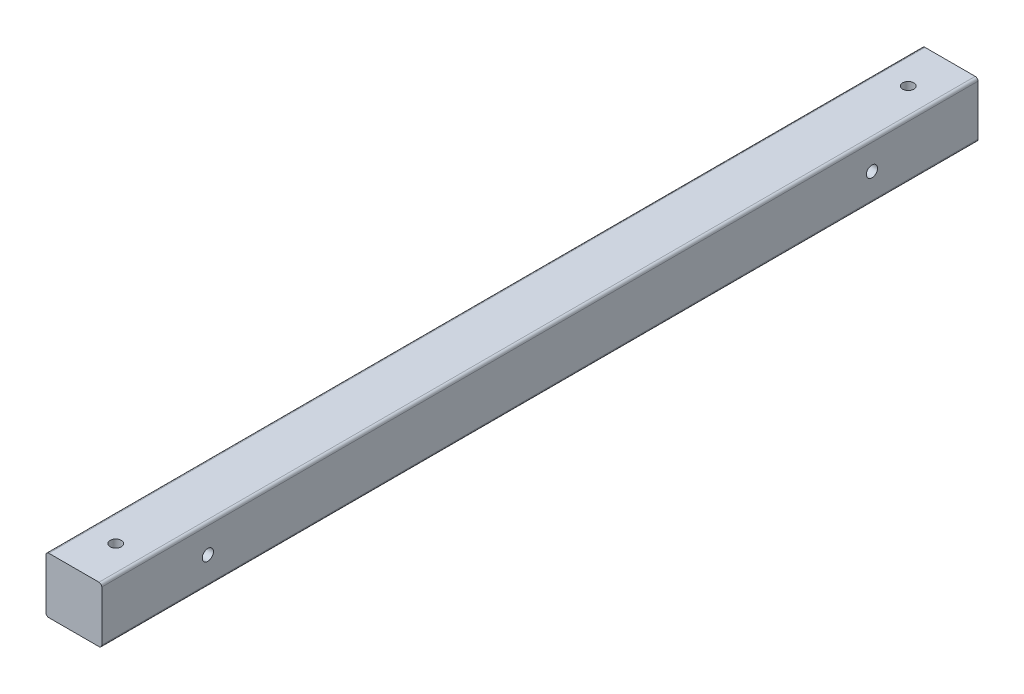
ISO-10303-21;
HEADER;
FILE_DESCRIPTION(('STEP AP214'),'2;1');
FILE_NAME('part.step','',(''),(''),'','','');
FILE_SCHEMA(('AUTOMOTIVE_DESIGN { 1 0 10303 214 1 1 1 1 }'));
ENDSEC;
DATA;
#1=APPLICATION_CONTEXT('core data for automotive mechanical design processes');
#2=APPLICATION_PROTOCOL_DEFINITION('international standard','automotive_design',2000,#1);
#3=PRODUCT_CONTEXT('',#1,'mechanical');
#4=PRODUCT('Part','Part','',(#3));
#5=PRODUCT_RELATED_PRODUCT_CATEGORY('part','',(#4));
#6=PRODUCT_DEFINITION_FORMATION('','',#4);
#7=PRODUCT_DEFINITION_CONTEXT('part definition',#1,'design');
#8=PRODUCT_DEFINITION('design','',#6,#7);
#9=PRODUCT_DEFINITION_SHAPE('','',#8);
#10=(LENGTH_UNIT() NAMED_UNIT(*) SI_UNIT(.MILLI.,.METRE.));
#11=(NAMED_UNIT(*) PLANE_ANGLE_UNIT() SI_UNIT($,.RADIAN.));
#12=(NAMED_UNIT(*) SI_UNIT($,.STERADIAN.) SOLID_ANGLE_UNIT());
#13=UNCERTAINTY_MEASURE_WITH_UNIT(LENGTH_MEASURE(1.E-05),#10,'distance_accuracy_value','');
#14=(GEOMETRIC_REPRESENTATION_CONTEXT(3) GLOBAL_UNCERTAINTY_ASSIGNED_CONTEXT((#13)) GLOBAL_UNIT_ASSIGNED_CONTEXT((#10,
#11,#12)) REPRESENTATION_CONTEXT('',''));
#15=CARTESIAN_POINT('',(0.,0.,0.));
#16=DIRECTION('',(0.,0.,1.));
#17=DIRECTION('',(1.,0.,0.));
#18=AXIS2_PLACEMENT_3D('',#15,#16,#17);
#19=CARTESIAN_POINT('',(0.,0.,314.));
#20=DIRECTION('',(1.,0.,0.));
#21=DIRECTION('',(0.,0.,-1.));
#22=AXIS2_PLACEMENT_3D('',#19,#20,#21);
#23=PLANE('',#22);
#24=CARTESIAN_POINT('',(0.,10.,38.));
#25=DIRECTION('',(-1.,0.,0.));
#26=DIRECTION('',(0.,0.,1.));
#27=AXIS2_PLACEMENT_3D('',#24,#25,#26);
#28=CIRCLE('',#27,2.);
#29=CARTESIAN_POINT('',(0.,10.,40.));
#30=VERTEX_POINT('',#29);
#31=EDGE_CURVE('E263',#30,#30,#28,.T.);
#32=ORIENTED_EDGE('',*,*,#31,.F.);
#33=EDGE_LOOP('',(#32));
#34=FACE_BOUND('',#33,.T.);
#35=CARTESIAN_POINT('',(0.,10.,276.));
#36=DIRECTION('',(-1.,0.,0.));
#37=DIRECTION('',(0.,0.,1.));
#38=AXIS2_PLACEMENT_3D('',#35,#36,#37);
#39=CIRCLE('',#38,2.);
#40=CARTESIAN_POINT('',(0.,10.,278.));
#41=VERTEX_POINT('',#40);
#42=EDGE_CURVE('E264',#41,#41,#39,.T.);
#43=ORIENTED_EDGE('',*,*,#42,.F.);
#44=EDGE_LOOP('',(#43));
#45=FACE_BOUND('',#44,.T.);
#46=DIRECTION('',(0.,-1.,0.));
#47=VECTOR('',#46,1.);
#48=CARTESIAN_POINT('',(0.,0.,0.));
#49=LINE('',#48,#47);
#50=CARTESIAN_POINT('',(0.,19.,0.));
#51=VERTEX_POINT('',#50);
#52=CARTESIAN_POINT('',(0.,1.,0.));
#53=VERTEX_POINT('',#52);
#54=EDGE_CURVE('E134',#51,#53,#49,.T.);
#55=ORIENTED_EDGE('',*,*,#54,.T.);
#56=DIRECTION('',(0.,0.,-1.));
#57=VECTOR('',#56,1.);
#58=CARTESIAN_POINT('',(0.,1.,314.));
#59=LINE('',#58,#57);
#60=CARTESIAN_POINT('',(0.,1.,314.));
#61=VERTEX_POINT('',#60);
#62=EDGE_CURVE('E109',#53,#61,#59,.F.);
#63=ORIENTED_EDGE('',*,*,#62,.T.);
#64=DIRECTION('',(0.,-1.,0.));
#65=VECTOR('',#64,1.);
#66=CARTESIAN_POINT('',(0.,0.,314.));
#67=LINE('',#66,#65);
#68=CARTESIAN_POINT('',(0.,19.,314.));
#69=VERTEX_POINT('',#68);
#70=EDGE_CURVE('E147',#69,#61,#67,.T.);
#71=ORIENTED_EDGE('',*,*,#70,.F.);
#72=DIRECTION('',(0.,0.,-1.));
#73=VECTOR('',#72,1.);
#74=CARTESIAN_POINT('',(0.,19.,314.));
#75=LINE('',#74,#73);
#76=EDGE_CURVE('E115',#69,#51,#75,.T.);
#77=ORIENTED_EDGE('',*,*,#76,.T.);
#78=EDGE_LOOP('',(#55,#63,#71,#77));
#79=FACE_BOUND('',#78,.T.);
#80=ADVANCED_FACE('F38',(#34,#45,#79),#23,.F.);
#81=CARTESIAN_POINT('',(0.,0.,314.));
#82=DIRECTION('',(0.,1.,0.));
#83=DIRECTION('',(0.,0.,1.));
#84=AXIS2_PLACEMENT_3D('',#81,#82,#83);
#85=PLANE('',#84);
#86=CARTESIAN_POINT('',(10.,0.,15.));
#87=DIRECTION('',(0.,1.,0.));
#88=DIRECTION('',(0.,0.,1.));
#89=AXIS2_PLACEMENT_3D('',#86,#87,#88);
#90=CIRCLE('',#89,2.);
#91=CARTESIAN_POINT('',(10.,0.,17.));
#92=VERTEX_POINT('',#91);
#93=EDGE_CURVE('E141',#92,#92,#90,.T.);
#94=ORIENTED_EDGE('',*,*,#93,.T.);
#95=EDGE_LOOP('',(#94));
#96=FACE_BOUND('',#95,.T.);
#97=CARTESIAN_POINT('',(10.,0.,299.));
#98=DIRECTION('',(0.,1.,0.));
#99=DIRECTION('',(0.,0.,1.));
#100=AXIS2_PLACEMENT_3D('',#97,#98,#99);
#101=CIRCLE('',#100,2.);
#102=CARTESIAN_POINT('',(10.,0.,301.));
#103=VERTEX_POINT('',#102);
#104=EDGE_CURVE('E278',#103,#103,#101,.T.);
#105=ORIENTED_EDGE('',*,*,#104,.T.);
#106=EDGE_LOOP('',(#105));
#107=FACE_BOUND('',#106,.T.);
#108=DIRECTION('',(1.,0.,0.));
#109=VECTOR('',#108,1.);
#110=CARTESIAN_POINT('',(0.,0.,314.));
#111=LINE('',#110,#109);
#112=CARTESIAN_POINT('',(1.,0.,314.));
#113=VERTEX_POINT('',#112);
#114=CARTESIAN_POINT('',(19.,0.,314.));
#115=VERTEX_POINT('',#114);
#116=EDGE_CURVE('E125',#113,#115,#111,.T.);
#117=ORIENTED_EDGE('',*,*,#116,.F.);
#118=DIRECTION('',(0.,0.,-1.));
#119=VECTOR('',#118,1.);
#120=CARTESIAN_POINT('',(1.,0.,314.));
#121=LINE('',#120,#119);
#122=CARTESIAN_POINT('',(1.,0.,0.));
#123=VERTEX_POINT('',#122);
#124=EDGE_CURVE('E108',#113,#123,#121,.T.);
#125=ORIENTED_EDGE('',*,*,#124,.T.);
#126=DIRECTION('',(1.,0.,0.));
#127=VECTOR('',#126,1.);
#128=CARTESIAN_POINT('',(0.,0.,0.));
#129=LINE('',#128,#127);
#130=CARTESIAN_POINT('',(19.,0.,0.));
#131=VERTEX_POINT('',#130);
#132=EDGE_CURVE('E122',#123,#131,#129,.T.);
#133=ORIENTED_EDGE('',*,*,#132,.T.);
#134=DIRECTION('',(0.,0.,-1.));
#135=VECTOR('',#134,1.);
#136=CARTESIAN_POINT('',(19.,0.,314.));
#137=LINE('',#136,#135);
#138=EDGE_CURVE('E128',#131,#115,#137,.F.);
#139=ORIENTED_EDGE('',*,*,#138,.T.);
#140=EDGE_LOOP('',(#117,#125,#133,#139));
#141=FACE_BOUND('',#140,.T.);
#142=ADVANCED_FACE('F121',(#96,#107,#141),#85,.F.);
#143=CARTESIAN_POINT('',(20.,0.,314.));
#144=DIRECTION('',(-1.,0.,0.));
#145=DIRECTION('',(0.,0.,1.));
#146=AXIS2_PLACEMENT_3D('',#143,#144,#145);
#147=PLANE('',#146);
#148=CARTESIAN_POINT('',(20.,10.,38.));
#149=DIRECTION('',(-1.,0.,0.));
#150=DIRECTION('',(0.,0.,1.));
#151=AXIS2_PLACEMENT_3D('',#148,#149,#150);
#152=CIRCLE('',#151,2.);
#153=CARTESIAN_POINT('',(20.,10.,40.));
#154=VERTEX_POINT('',#153);
#155=EDGE_CURVE('E258',#154,#154,#152,.T.);
#156=ORIENTED_EDGE('',*,*,#155,.T.);
#157=EDGE_LOOP('',(#156));
#158=FACE_BOUND('',#157,.T.);
#159=CARTESIAN_POINT('',(20.,10.,276.));
#160=DIRECTION('',(-1.,0.,0.));
#161=DIRECTION('',(0.,0.,1.));
#162=AXIS2_PLACEMENT_3D('',#159,#160,#161);
#163=CIRCLE('',#162,2.);
#164=CARTESIAN_POINT('',(20.,10.,278.));
#165=VERTEX_POINT('',#164);
#166=EDGE_CURVE('E261',#165,#165,#163,.T.);
#167=ORIENTED_EDGE('',*,*,#166,.T.);
#168=EDGE_LOOP('',(#167));
#169=FACE_BOUND('',#168,.T.);
#170=DIRECTION('',(0.,1.,0.));
#171=VECTOR('',#170,1.);
#172=CARTESIAN_POINT('',(20.,0.,314.));
#173=LINE('',#172,#171);
#174=CARTESIAN_POINT('',(20.,1.,314.));
#175=VERTEX_POINT('',#174);
#176=CARTESIAN_POINT('',(20.,19.,314.));
#177=VERTEX_POINT('',#176);
#178=EDGE_CURVE('E196',#175,#177,#173,.T.);
#179=ORIENTED_EDGE('',*,*,#178,.F.);
#180=DIRECTION('',(0.,0.,-1.));
#181=VECTOR('',#180,1.);
#182=CARTESIAN_POINT('',(20.,1.,314.));
#183=LINE('',#182,#181);
#184=CARTESIAN_POINT('',(20.,1.,0.));
#185=VERTEX_POINT('',#184);
#186=EDGE_CURVE('E177',#175,#185,#183,.T.);
#187=ORIENTED_EDGE('',*,*,#186,.T.);
#188=DIRECTION('',(0.,1.,0.));
#189=VECTOR('',#188,1.);
#190=CARTESIAN_POINT('',(20.,0.,0.));
#191=LINE('',#190,#189);
#192=CARTESIAN_POINT('',(20.,19.,0.));
#193=VERTEX_POINT('',#192);
#194=EDGE_CURVE('E133',#185,#193,#191,.T.);
#195=ORIENTED_EDGE('',*,*,#194,.T.);
#196=DIRECTION('',(0.,0.,-1.));
#197=VECTOR('',#196,1.);
#198=CARTESIAN_POINT('',(20.,19.,314.));
#199=LINE('',#198,#197);
#200=EDGE_CURVE('E174',#193,#177,#199,.F.);
#201=ORIENTED_EDGE('',*,*,#200,.T.);
#202=EDGE_LOOP('',(#179,#187,#195,#201));
#203=FACE_BOUND('',#202,.T.);
#204=ADVANCED_FACE('F212',(#158,#169,#203),#147,.F.);
#205=CARTESIAN_POINT('',(0.,20.,314.));
#206=DIRECTION('',(0.,-1.,0.));
#207=DIRECTION('',(0.,0.,-1.));
#208=AXIS2_PLACEMENT_3D('',#205,#206,#207);
#209=PLANE('',#208);
#210=CARTESIAN_POINT('',(10.,20.,15.));
#211=DIRECTION('',(0.,1.,0.));
#212=DIRECTION('',(0.,0.,1.));
#213=AXIS2_PLACEMENT_3D('',#210,#211,#212);
#214=CIRCLE('',#213,2.);
#215=CARTESIAN_POINT('',(10.,20.,17.));
#216=VERTEX_POINT('',#215);
#217=EDGE_CURVE('E274',#216,#216,#214,.T.);
#218=ORIENTED_EDGE('',*,*,#217,.F.);
#219=EDGE_LOOP('',(#218));
#220=FACE_BOUND('',#219,.T.);
#221=CARTESIAN_POINT('',(10.,20.,299.));
#222=DIRECTION('',(0.,1.,0.));
#223=DIRECTION('',(0.,0.,1.));
#224=AXIS2_PLACEMENT_3D('',#221,#222,#223);
#225=CIRCLE('',#224,2.);
#226=CARTESIAN_POINT('',(10.,20.,301.));
#227=VERTEX_POINT('',#226);
#228=EDGE_CURVE('E279',#227,#227,#225,.T.);
#229=ORIENTED_EDGE('',*,*,#228,.F.);
#230=EDGE_LOOP('',(#229));
#231=FACE_BOUND('',#230,.T.);
#232=DIRECTION('',(-1.,0.,0.));
#233=VECTOR('',#232,1.);
#234=CARTESIAN_POINT('',(0.,20.,0.));
#235=LINE('',#234,#233);
#236=CARTESIAN_POINT('',(19.,20.,0.));
#237=VERTEX_POINT('',#236);
#238=CARTESIAN_POINT('',(1.,20.,0.));
#239=VERTEX_POINT('',#238);
#240=EDGE_CURVE('E139',#237,#239,#235,.T.);
#241=ORIENTED_EDGE('',*,*,#240,.T.);
#242=DIRECTION('',(0.,0.,-1.));
#243=VECTOR('',#242,1.);
#244=CARTESIAN_POINT('',(1.,20.,314.));
#245=LINE('',#244,#243);
#246=CARTESIAN_POINT('',(1.,20.,314.));
#247=VERTEX_POINT('',#246);
#248=EDGE_CURVE('E11',#239,#247,#245,.F.);
#249=ORIENTED_EDGE('',*,*,#248,.T.);
#250=DIRECTION('',(-1.,0.,0.));
#251=VECTOR('',#250,1.);
#252=CARTESIAN_POINT('',(0.,20.,314.));
#253=LINE('',#252,#251);
#254=CARTESIAN_POINT('',(19.,20.,314.));
#255=VERTEX_POINT('',#254);
#256=EDGE_CURVE('E149',#255,#247,#253,.T.);
#257=ORIENTED_EDGE('',*,*,#256,.F.);
#258=DIRECTION('',(0.,0.,-1.));
#259=VECTOR('',#258,1.);
#260=CARTESIAN_POINT('',(19.,20.,314.));
#261=LINE('',#260,#259);
#262=EDGE_CURVE('E47',#255,#237,#261,.T.);
#263=ORIENTED_EDGE('',*,*,#262,.T.);
#264=EDGE_LOOP('',(#241,#249,#257,#263));
#265=FACE_BOUND('',#264,.T.);
#266=ADVANCED_FACE('F184',(#220,#231,#265),#209,.F.);
#267=CARTESIAN_POINT('',(0.,0.,314.));
#268=DIRECTION('',(0.,0.,-1.));
#269=DIRECTION('',(-1.,0.,0.));
#270=AXIS2_PLACEMENT_3D('',#267,#268,#269);
#271=PLANE('',#270);
#272=ORIENTED_EDGE('',*,*,#70,.T.);
#273=CARTESIAN_POINT('',(1.,1.,314.));
#274=DIRECTION('',(0.,0.,-1.));
#275=DIRECTION('',(-1.,0.,0.));
#276=AXIS2_PLACEMENT_3D('',#273,#274,#275);
#277=CIRCLE('',#276,1.);
#278=EDGE_CURVE('E171',#61,#113,#277,.F.);
#279=ORIENTED_EDGE('',*,*,#278,.T.);
#280=ORIENTED_EDGE('',*,*,#116,.T.);
#281=CARTESIAN_POINT('',(19.,1.,314.));
#282=DIRECTION('',(0.,0.,-1.));
#283=DIRECTION('',(-1.,0.,0.));
#284=AXIS2_PLACEMENT_3D('',#281,#282,#283);
#285=CIRCLE('',#284,1.);
#286=EDGE_CURVE('E168',#115,#175,#285,.F.);
#287=ORIENTED_EDGE('',*,*,#286,.T.);
#288=ORIENTED_EDGE('',*,*,#178,.T.);
#289=CARTESIAN_POINT('',(19.,19.,314.));
#290=DIRECTION('',(0.,0.,-1.));
#291=DIRECTION('',(-1.,0.,0.));
#292=AXIS2_PLACEMENT_3D('',#289,#290,#291);
#293=CIRCLE('',#292,1.);
#294=EDGE_CURVE('E59',#177,#255,#293,.F.);
#295=ORIENTED_EDGE('',*,*,#294,.T.);
#296=ORIENTED_EDGE('',*,*,#256,.T.);
#297=CARTESIAN_POINT('',(1.,19.,314.));
#298=DIRECTION('',(0.,0.,-1.));
#299=DIRECTION('',(-1.,0.,0.));
#300=AXIS2_PLACEMENT_3D('',#297,#298,#299);
#301=CIRCLE('',#300,1.);
#302=EDGE_CURVE('E165',#247,#69,#301,.F.);
#303=ORIENTED_EDGE('',*,*,#302,.T.);
#304=EDGE_LOOP('',(#272,#279,#280,#287,#288,#295,#296,#303));
#305=FACE_BOUND('',#304,.T.);
#306=ADVANCED_FACE('F203',(#305),#271,.F.);
#307=CARTESIAN_POINT('',(0.,0.,0.));
#308=DIRECTION('',(0.,0.,-1.));
#309=DIRECTION('',(-1.,0.,0.));
#310=AXIS2_PLACEMENT_3D('',#307,#308,#309);
#311=PLANE('',#310);
#312=ORIENTED_EDGE('',*,*,#132,.F.);
#313=CARTESIAN_POINT('',(1.,1.,0.));
#314=DIRECTION('',(0.,0.,-1.));
#315=DIRECTION('',(-1.,0.,0.));
#316=AXIS2_PLACEMENT_3D('',#313,#314,#315);
#317=CIRCLE('',#316,1.);
#318=EDGE_CURVE('E104',#123,#53,#317,.T.);
#319=ORIENTED_EDGE('',*,*,#318,.T.);
#320=ORIENTED_EDGE('',*,*,#54,.F.);
#321=CARTESIAN_POINT('',(1.,19.,0.));
#322=DIRECTION('',(0.,0.,-1.));
#323=DIRECTION('',(-1.,0.,0.));
#324=AXIS2_PLACEMENT_3D('',#321,#322,#323);
#325=CIRCLE('',#324,1.);
#326=EDGE_CURVE('E153',#51,#239,#325,.T.);
#327=ORIENTED_EDGE('',*,*,#326,.T.);
#328=ORIENTED_EDGE('',*,*,#240,.F.);
#329=CARTESIAN_POINT('',(19.,19.,0.));
#330=DIRECTION('',(0.,0.,-1.));
#331=DIRECTION('',(-1.,0.,0.));
#332=AXIS2_PLACEMENT_3D('',#329,#330,#331);
#333=CIRCLE('',#332,1.);
#334=EDGE_CURVE('E127',#237,#193,#333,.T.);
#335=ORIENTED_EDGE('',*,*,#334,.T.);
#336=ORIENTED_EDGE('',*,*,#194,.F.);
#337=CARTESIAN_POINT('',(19.,1.,0.));
#338=DIRECTION('',(0.,0.,-1.));
#339=DIRECTION('',(-1.,0.,0.));
#340=AXIS2_PLACEMENT_3D('',#337,#338,#339);
#341=CIRCLE('',#340,1.);
#342=EDGE_CURVE('E116',#185,#131,#341,.T.);
#343=ORIENTED_EDGE('',*,*,#342,.T.);
#344=EDGE_LOOP('',(#312,#319,#320,#327,#328,#335,#336,#343));
#345=FACE_BOUND('',#344,.T.);
#346=ADVANCED_FACE('F130',(#345),#311,.T.);
#347=CARTESIAN_POINT('',(10.,-294.,299.));
#348=DIRECTION('',(0.,1.,0.));
#349=DIRECTION('',(0.,0.,1.));
#350=AXIS2_PLACEMENT_3D('',#347,#348,#349);
#351=CYLINDRICAL_SURFACE('',#350,2.);
#352=ORIENTED_EDGE('',*,*,#228,.T.);
#353=EDGE_LOOP('',(#352));
#354=FACE_BOUND('',#353,.T.);
#355=ORIENTED_EDGE('',*,*,#104,.F.);
#356=EDGE_LOOP('',(#355));
#357=FACE_BOUND('',#356,.T.);
#358=ADVANCED_FACE('F210',(#354,#357),#351,.F.);
#359=CARTESIAN_POINT('',(10.,-294.,15.));
#360=DIRECTION('',(0.,1.,0.));
#361=DIRECTION('',(0.,0.,1.));
#362=AXIS2_PLACEMENT_3D('',#359,#360,#361);
#363=CYLINDRICAL_SURFACE('',#362,2.);
#364=ORIENTED_EDGE('',*,*,#217,.T.);
#365=EDGE_LOOP('',(#364));
#366=FACE_BOUND('',#365,.T.);
#367=ORIENTED_EDGE('',*,*,#93,.F.);
#368=EDGE_LOOP('',(#367));
#369=FACE_BOUND('',#368,.T.);
#370=ADVANCED_FACE('F233',(#366,#369),#363,.F.);
#371=CARTESIAN_POINT('',(1.,1.,314.));
#372=DIRECTION('',(0.,0.,-1.));
#373=DIRECTION('',(-1.,0.,0.));
#374=AXIS2_PLACEMENT_3D('',#371,#372,#373);
#375=CYLINDRICAL_SURFACE('',#374,1.);
#376=ORIENTED_EDGE('',*,*,#278,.F.);
#377=ORIENTED_EDGE('',*,*,#62,.F.);
#378=ORIENTED_EDGE('',*,*,#318,.F.);
#379=ORIENTED_EDGE('',*,*,#124,.F.);
#380=EDGE_LOOP('',(#376,#377,#378,#379));
#381=FACE_BOUND('',#380,.T.);
#382=ADVANCED_FACE('F107',(#381),#375,.T.);
#383=CARTESIAN_POINT('',(19.,1.,314.));
#384=DIRECTION('',(0.,0.,-1.));
#385=DIRECTION('',(-1.,0.,0.));
#386=AXIS2_PLACEMENT_3D('',#383,#384,#385);
#387=CYLINDRICAL_SURFACE('',#386,1.);
#388=ORIENTED_EDGE('',*,*,#286,.F.);
#389=ORIENTED_EDGE('',*,*,#138,.F.);
#390=ORIENTED_EDGE('',*,*,#342,.F.);
#391=ORIENTED_EDGE('',*,*,#186,.F.);
#392=EDGE_LOOP('',(#388,#389,#390,#391));
#393=FACE_BOUND('',#392,.T.);
#394=ADVANCED_FACE('F232',(#393),#387,.T.);
#395=CARTESIAN_POINT('',(1.,19.,314.));
#396=DIRECTION('',(0.,0.,-1.));
#397=DIRECTION('',(-1.,0.,0.));
#398=AXIS2_PLACEMENT_3D('',#395,#396,#397);
#399=CYLINDRICAL_SURFACE('',#398,1.);
#400=ORIENTED_EDGE('',*,*,#302,.F.);
#401=ORIENTED_EDGE('',*,*,#248,.F.);
#402=ORIENTED_EDGE('',*,*,#326,.F.);
#403=ORIENTED_EDGE('',*,*,#76,.F.);
#404=EDGE_LOOP('',(#400,#401,#402,#403));
#405=FACE_BOUND('',#404,.T.);
#406=ADVANCED_FACE('F189',(#405),#399,.T.);
#407=CARTESIAN_POINT('',(19.,19.,314.));
#408=DIRECTION('',(0.,0.,-1.));
#409=DIRECTION('',(-1.,0.,0.));
#410=AXIS2_PLACEMENT_3D('',#407,#408,#409);
#411=CYLINDRICAL_SURFACE('',#410,1.);
#412=ORIENTED_EDGE('',*,*,#294,.F.);
#413=ORIENTED_EDGE('',*,*,#200,.F.);
#414=ORIENTED_EDGE('',*,*,#334,.F.);
#415=ORIENTED_EDGE('',*,*,#262,.F.);
#416=EDGE_LOOP('',(#412,#413,#414,#415));
#417=FACE_BOUND('',#416,.T.);
#418=ADVANCED_FACE('F40',(#417),#411,.T.);
#419=CARTESIAN_POINT('',(20.,10.,276.));
#420=DIRECTION('',(-1.,0.,0.));
#421=DIRECTION('',(0.,0.,1.));
#422=AXIS2_PLACEMENT_3D('',#419,#420,#421);
#423=CYLINDRICAL_SURFACE('',#422,2.);
#424=ORIENTED_EDGE('',*,*,#166,.F.);
#425=EDGE_LOOP('',(#424));
#426=FACE_BOUND('',#425,.T.);
#427=ORIENTED_EDGE('',*,*,#42,.T.);
#428=EDGE_LOOP('',(#427));
#429=FACE_BOUND('',#428,.T.);
#430=ADVANCED_FACE('F240',(#426,#429),#423,.F.);
#431=CARTESIAN_POINT('',(20.,10.,38.));
#432=DIRECTION('',(-1.,0.,0.));
#433=DIRECTION('',(0.,0.,1.));
#434=AXIS2_PLACEMENT_3D('',#431,#432,#433);
#435=CYLINDRICAL_SURFACE('',#434,2.);
#436=ORIENTED_EDGE('',*,*,#155,.F.);
#437=EDGE_LOOP('',(#436));
#438=FACE_BOUND('',#437,.T.);
#439=ORIENTED_EDGE('',*,*,#31,.T.);
#440=EDGE_LOOP('',(#439));
#441=FACE_BOUND('',#440,.T.);
#442=ADVANCED_FACE('F243',(#438,#441),#435,.F.);
#443=CLOSED_SHELL('',(#80,#142,#204,#266,#306,#346,#358,#370,#382,#394,#406,#418,#430,#442));
#444=MANIFOLD_SOLID_BREP('B2',#443);
#445=ADVANCED_BREP_SHAPE_REPRESENTATION('',(#18,#444),#14);
#446=SHAPE_DEFINITION_REPRESENTATION(#9,#445);
ENDSEC;
END-ISO-10303-21;
